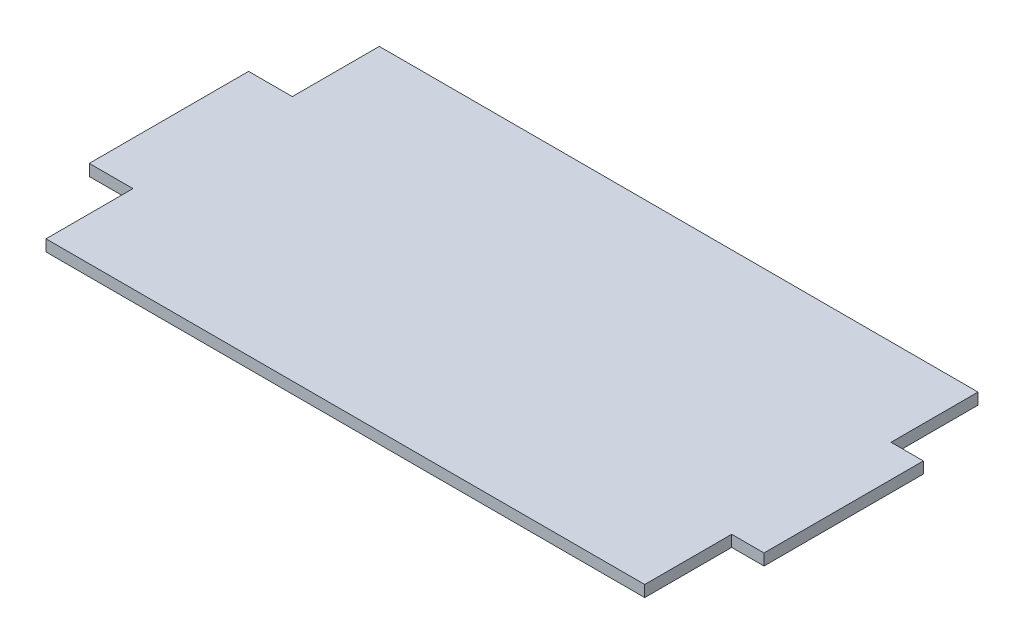
ISO-10303-21;
HEADER;
FILE_DESCRIPTION(('STEP AP214'),'2;1');
FILE_NAME('part.step','',(''),(''),'','','');
FILE_SCHEMA(('AUTOMOTIVE_DESIGN { 1 0 10303 214 1 1 1 1 }'));
ENDSEC;
DATA;
#1=APPLICATION_CONTEXT('core data for automotive mechanical design processes');
#2=APPLICATION_PROTOCOL_DEFINITION('international standard','automotive_design',2000,#1);
#3=PRODUCT_CONTEXT('',#1,'mechanical');
#4=PRODUCT('Part','Part','',(#3));
#5=PRODUCT_RELATED_PRODUCT_CATEGORY('part','',(#4));
#6=PRODUCT_DEFINITION_FORMATION('','',#4);
#7=PRODUCT_DEFINITION_CONTEXT('part definition',#1,'design');
#8=PRODUCT_DEFINITION('design','',#6,#7);
#9=PRODUCT_DEFINITION_SHAPE('','',#8);
#10=(LENGTH_UNIT() NAMED_UNIT(*) SI_UNIT(.MILLI.,.METRE.));
#11=(NAMED_UNIT(*) PLANE_ANGLE_UNIT() SI_UNIT($,.RADIAN.));
#12=(NAMED_UNIT(*) SI_UNIT($,.STERADIAN.) SOLID_ANGLE_UNIT());
#13=UNCERTAINTY_MEASURE_WITH_UNIT(LENGTH_MEASURE(1.E-05),#10,'distance_accuracy_value','');
#14=(GEOMETRIC_REPRESENTATION_CONTEXT(3) GLOBAL_UNCERTAINTY_ASSIGNED_CONTEXT((#13)) GLOBAL_UNIT_ASSIGNED_CONTEXT((#10,
#11,#12)) REPRESENTATION_CONTEXT('',''));
#15=CARTESIAN_POINT('',(0.,0.,0.));
#16=DIRECTION('',(0.,0.,1.));
#17=DIRECTION('',(1.,0.,0.));
#18=AXIS2_PLACEMENT_3D('',#15,#16,#17);
#19=CARTESIAN_POINT('',(0.,20.,35.));
#20=DIRECTION('',(0.,0.,1.));
#21=DIRECTION('',(1.,0.,0.));
#22=AXIS2_PLACEMENT_3D('',#19,#20,#21);
#23=PLANE('',#22);
#24=DIRECTION('',(-1.,0.,0.));
#25=VECTOR('',#24,1.);
#26=CARTESIAN_POINT('',(0.,15.,35.));
#27=LINE('',#26,#25);
#28=CARTESIAN_POINT('',(-129.,15.,35.0000000000001));
#29=VERTEX_POINT('',#28);
#30=CARTESIAN_POINT('',(-148.2,15.,35.0000000000001));
#31=VERTEX_POINT('',#30);
#32=EDGE_CURVE('E164',#29,#31,#27,.T.);
#33=ORIENTED_EDGE('',*,*,#32,.F.);
#34=DIRECTION('',(0.,-1.,0.));
#35=VECTOR('',#34,1.);
#36=CARTESIAN_POINT('',(-129.,20.,35.0000000000001));
#37=LINE('',#36,#35);
#38=CARTESIAN_POINT('',(-129.,20.,35.0000000000001));
#39=VERTEX_POINT('',#38);
#40=EDGE_CURVE('E11',#39,#29,#37,.T.);
#41=ORIENTED_EDGE('',*,*,#40,.F.);
#42=DIRECTION('',(-1.,0.,0.));
#43=VECTOR('',#42,1.);
#44=CARTESIAN_POINT('',(0.,20.,35.));
#45=LINE('',#44,#43);
#46=CARTESIAN_POINT('',(-148.2,20.,35.0000000000001));
#47=VERTEX_POINT('',#46);
#48=EDGE_CURVE('E190',#39,#47,#45,.T.);
#49=ORIENTED_EDGE('',*,*,#48,.T.);
#50=DIRECTION('',(0.,-1.,0.));
#51=VECTOR('',#50,1.);
#52=CARTESIAN_POINT('',(-148.2,20.,35.0000000000001));
#53=LINE('',#52,#51);
#54=EDGE_CURVE('E108',#47,#31,#53,.T.);
#55=ORIENTED_EDGE('',*,*,#54,.T.);
#56=EDGE_LOOP('',(#33,#41,#49,#55));
#57=FACE_BOUND('',#56,.T.);
#58=ADVANCED_FACE('F45',(#57),#23,.T.);
#59=CARTESIAN_POINT('',(-129.,20.,0.));
#60=DIRECTION('',(1.,0.,0.));
#61=DIRECTION('',(0.,0.,-1.));
#62=AXIS2_PLACEMENT_3D('',#59,#60,#61);
#63=PLANE('',#62);
#64=DIRECTION('',(0.,0.,1.));
#65=VECTOR('',#64,1.);
#66=CARTESIAN_POINT('',(-129.,15.,0.));
#67=LINE('',#66,#65);
#68=CARTESIAN_POINT('',(-129.,15.,73.2));
#69=VERTEX_POINT('',#68);
#70=EDGE_CURVE('E167',#29,#69,#67,.T.);
#71=ORIENTED_EDGE('',*,*,#70,.T.);
#72=DIRECTION('',(0.,-1.,0.));
#73=VECTOR('',#72,1.);
#74=CARTESIAN_POINT('',(-129.,20.,73.2));
#75=LINE('',#74,#73);
#76=CARTESIAN_POINT('',(-129.,20.,73.2));
#77=VERTEX_POINT('',#76);
#78=EDGE_CURVE('E53',#77,#69,#75,.T.);
#79=ORIENTED_EDGE('',*,*,#78,.F.);
#80=DIRECTION('',(0.,0.,1.));
#81=VECTOR('',#80,1.);
#82=CARTESIAN_POINT('',(-129.,20.,0.));
#83=LINE('',#82,#81);
#84=EDGE_CURVE('E150',#39,#77,#83,.T.);
#85=ORIENTED_EDGE('',*,*,#84,.F.);
#86=ORIENTED_EDGE('',*,*,#40,.T.);
#87=EDGE_LOOP('',(#71,#79,#85,#86));
#88=FACE_BOUND('',#87,.T.);
#89=ADVANCED_FACE('F257',(#88),#63,.F.);
#90=CARTESIAN_POINT('',(0.,20.,73.2));
#91=DIRECTION('',(0.,0.,-1.));
#92=DIRECTION('',(0.,1.,0.));
#93=AXIS2_PLACEMENT_3D('',#90,#91,#92);
#94=PLANE('',#93);
#95=DIRECTION('',(1.,0.,0.));
#96=VECTOR('',#95,1.);
#97=CARTESIAN_POINT('',(0.,15.,73.2));
#98=LINE('',#97,#96);
#99=CARTESIAN_POINT('',(134.,15.,73.2));
#100=VERTEX_POINT('',#99);
#101=EDGE_CURVE('E169',#69,#100,#98,.T.);
#102=ORIENTED_EDGE('',*,*,#101,.T.);
#103=DIRECTION('',(0.,-1.,0.));
#104=VECTOR('',#103,1.);
#105=CARTESIAN_POINT('',(134.,20.,73.2));
#106=LINE('',#105,#104);
#107=CARTESIAN_POINT('',(134.,20.,73.2));
#108=VERTEX_POINT('',#107);
#109=EDGE_CURVE('E205',#108,#100,#106,.T.);
#110=ORIENTED_EDGE('',*,*,#109,.F.);
#111=DIRECTION('',(1.,0.,0.));
#112=VECTOR('',#111,1.);
#113=CARTESIAN_POINT('',(0.,20.,73.2));
#114=LINE('',#113,#112);
#115=EDGE_CURVE('E213',#77,#108,#114,.T.);
#116=ORIENTED_EDGE('',*,*,#115,.F.);
#117=ORIENTED_EDGE('',*,*,#78,.T.);
#118=EDGE_LOOP('',(#102,#110,#116,#117));
#119=FACE_BOUND('',#118,.T.);
#120=ADVANCED_FACE('F211',(#119),#94,.F.);
#121=CARTESIAN_POINT('',(134.,20.,0.));
#122=DIRECTION('',(1.,0.,0.));
#123=DIRECTION('',(0.,0.,-1.));
#124=AXIS2_PLACEMENT_3D('',#121,#122,#123);
#125=PLANE('',#124);
#126=DIRECTION('',(0.,0.,1.));
#127=VECTOR('',#126,1.);
#128=CARTESIAN_POINT('',(134.,15.,0.));
#129=LINE('',#128,#127);
#130=CARTESIAN_POINT('',(134.,15.,35.));
#131=VERTEX_POINT('',#130);
#132=EDGE_CURVE('E172',#131,#100,#129,.T.);
#133=ORIENTED_EDGE('',*,*,#132,.F.);
#134=DIRECTION('',(0.,-1.,0.));
#135=VECTOR('',#134,1.);
#136=CARTESIAN_POINT('',(134.,20.,35.));
#137=LINE('',#136,#135);
#138=CARTESIAN_POINT('',(134.,20.,35.));
#139=VERTEX_POINT('',#138);
#140=EDGE_CURVE('E203',#139,#131,#137,.T.);
#141=ORIENTED_EDGE('',*,*,#140,.F.);
#142=DIRECTION('',(0.,0.,1.));
#143=VECTOR('',#142,1.);
#144=CARTESIAN_POINT('',(134.,20.,0.));
#145=LINE('',#144,#143);
#146=EDGE_CURVE('E226',#139,#108,#145,.T.);
#147=ORIENTED_EDGE('',*,*,#146,.T.);
#148=ORIENTED_EDGE('',*,*,#109,.T.);
#149=EDGE_LOOP('',(#133,#141,#147,#148));
#150=FACE_BOUND('',#149,.T.);
#151=ADVANCED_FACE('F222',(#150),#125,.T.);
#152=CARTESIAN_POINT('',(0.,20.,35.));
#153=DIRECTION('',(0.,0.,-1.));
#154=DIRECTION('',(0.,1.,0.));
#155=AXIS2_PLACEMENT_3D('',#152,#153,#154);
#156=PLANE('',#155);
#157=DIRECTION('',(1.,0.,0.));
#158=VECTOR('',#157,1.);
#159=CARTESIAN_POINT('',(0.,15.,35.));
#160=LINE('',#159,#158);
#161=CARTESIAN_POINT('',(148.2,15.,35.));
#162=VERTEX_POINT('',#161);
#163=EDGE_CURVE('E175',#131,#162,#160,.T.);
#164=ORIENTED_EDGE('',*,*,#163,.T.);
#165=DIRECTION('',(0.,-1.,0.));
#166=VECTOR('',#165,1.);
#167=CARTESIAN_POINT('',(148.2,20.,35.));
#168=LINE('',#167,#166);
#169=CARTESIAN_POINT('',(148.2,20.,35.));
#170=VERTEX_POINT('',#169);
#171=EDGE_CURVE('E200',#170,#162,#168,.T.);
#172=ORIENTED_EDGE('',*,*,#171,.F.);
#173=DIRECTION('',(1.,0.,0.));
#174=VECTOR('',#173,1.);
#175=CARTESIAN_POINT('',(0.,20.,35.));
#176=LINE('',#175,#174);
#177=EDGE_CURVE('E227',#139,#170,#176,.T.);
#178=ORIENTED_EDGE('',*,*,#177,.F.);
#179=ORIENTED_EDGE('',*,*,#140,.T.);
#180=EDGE_LOOP('',(#164,#172,#178,#179));
#181=FACE_BOUND('',#180,.T.);
#182=ADVANCED_FACE('F280',(#181),#156,.F.);
#183=CARTESIAN_POINT('',(148.2,20.,0.));
#184=DIRECTION('',(-1.,0.,0.));
#185=DIRECTION('',(0.,0.,1.));
#186=AXIS2_PLACEMENT_3D('',#183,#184,#185);
#187=PLANE('',#186);
#188=DIRECTION('',(0.,0.,-1.));
#189=VECTOR('',#188,1.);
#190=CARTESIAN_POINT('',(148.2,15.,0.));
#191=LINE('',#190,#189);
#192=CARTESIAN_POINT('',(148.2,15.,-35.0000000000001));
#193=VERTEX_POINT('',#192);
#194=EDGE_CURVE('E178',#162,#193,#191,.T.);
#195=ORIENTED_EDGE('',*,*,#194,.T.);
#196=DIRECTION('',(0.,-1.,0.));
#197=VECTOR('',#196,1.);
#198=CARTESIAN_POINT('',(148.2,20.,-35.0000000000001));
#199=LINE('',#198,#197);
#200=CARTESIAN_POINT('',(148.2,20.,-35.0000000000001));
#201=VERTEX_POINT('',#200);
#202=EDGE_CURVE('E198',#201,#193,#199,.T.);
#203=ORIENTED_EDGE('',*,*,#202,.F.);
#204=DIRECTION('',(0.,0.,-1.));
#205=VECTOR('',#204,1.);
#206=CARTESIAN_POINT('',(148.2,20.,0.));
#207=LINE('',#206,#205);
#208=EDGE_CURVE('E230',#170,#201,#207,.T.);
#209=ORIENTED_EDGE('',*,*,#208,.F.);
#210=ORIENTED_EDGE('',*,*,#171,.T.);
#211=EDGE_LOOP('',(#195,#203,#209,#210));
#212=FACE_BOUND('',#211,.T.);
#213=ADVANCED_FACE('F244',(#212),#187,.F.);
#214=CARTESIAN_POINT('',(0.,20.,-35.0000000000001));
#215=DIRECTION('',(0.,0.,-1.));
#216=DIRECTION('',(0.,1.,0.));
#217=AXIS2_PLACEMENT_3D('',#214,#215,#216);
#218=PLANE('',#217);
#219=DIRECTION('',(1.,0.,0.));
#220=VECTOR('',#219,1.);
#221=CARTESIAN_POINT('',(0.,15.,-35.0000000000001));
#222=LINE('',#221,#220);
#223=CARTESIAN_POINT('',(134.,15.,-35.0000000000001));
#224=VERTEX_POINT('',#223);
#225=EDGE_CURVE('E181',#224,#193,#222,.T.);
#226=ORIENTED_EDGE('',*,*,#225,.F.);
#227=DIRECTION('',(0.,-1.,0.));
#228=VECTOR('',#227,1.);
#229=CARTESIAN_POINT('',(134.,20.,-35.0000000000001));
#230=LINE('',#229,#228);
#231=CARTESIAN_POINT('',(134.,20.,-35.0000000000001));
#232=VERTEX_POINT('',#231);
#233=EDGE_CURVE('E196',#232,#224,#230,.T.);
#234=ORIENTED_EDGE('',*,*,#233,.F.);
#235=DIRECTION('',(1.,0.,0.));
#236=VECTOR('',#235,1.);
#237=CARTESIAN_POINT('',(0.,20.,-35.0000000000001));
#238=LINE('',#237,#236);
#239=EDGE_CURVE('E234',#232,#201,#238,.T.);
#240=ORIENTED_EDGE('',*,*,#239,.T.);
#241=ORIENTED_EDGE('',*,*,#202,.T.);
#242=EDGE_LOOP('',(#226,#234,#240,#241));
#243=FACE_BOUND('',#242,.T.);
#244=ADVANCED_FACE('F246',(#243),#218,.T.);
#245=CARTESIAN_POINT('',(134.,15.,-73.2000000000002));
#246=VERTEX_POINT('',#245);
#247=EDGE_CURVE('E176',#246,#224,#129,.T.);
#248=ORIENTED_EDGE('',*,*,#247,.F.);
#249=DIRECTION('',(0.,-1.,0.));
#250=VECTOR('',#249,1.);
#251=CARTESIAN_POINT('',(134.,20.,-73.2000000000002));
#252=LINE('',#251,#250);
#253=CARTESIAN_POINT('',(134.,20.,-73.2000000000002));
#254=VERTEX_POINT('',#253);
#255=EDGE_CURVE('E194',#254,#246,#252,.T.);
#256=ORIENTED_EDGE('',*,*,#255,.F.);
#257=EDGE_CURVE('E229',#254,#232,#145,.T.);
#258=ORIENTED_EDGE('',*,*,#257,.T.);
#259=ORIENTED_EDGE('',*,*,#233,.T.);
#260=EDGE_LOOP('',(#248,#256,#258,#259));
#261=FACE_BOUND('',#260,.T.);
#262=ADVANCED_FACE('F250',(#261),#125,.T.);
#263=CARTESIAN_POINT('',(0.,20.,-73.2000000000001));
#264=DIRECTION('',(0.,0.,-1.));
#265=DIRECTION('',(-1.,0.,0.));
#266=AXIS2_PLACEMENT_3D('',#263,#264,#265);
#267=PLANE('',#266);
#268=DIRECTION('',(1.,0.,0.));
#269=VECTOR('',#268,1.);
#270=CARTESIAN_POINT('',(0.,15.,-73.2000000000001));
#271=LINE('',#270,#269);
#272=CARTESIAN_POINT('',(-129.,15.,-73.2000000000001));
#273=VERTEX_POINT('',#272);
#274=EDGE_CURVE('E184',#273,#246,#271,.T.);
#275=ORIENTED_EDGE('',*,*,#274,.F.);
#276=DIRECTION('',(0.,-1.,0.));
#277=VECTOR('',#276,1.);
#278=CARTESIAN_POINT('',(-129.,20.,-73.2000000000001));
#279=LINE('',#278,#277);
#280=CARTESIAN_POINT('',(-129.,20.,-73.2000000000001));
#281=VERTEX_POINT('',#280);
#282=EDGE_CURVE('E155',#281,#273,#279,.T.);
#283=ORIENTED_EDGE('',*,*,#282,.F.);
#284=DIRECTION('',(1.,0.,0.));
#285=VECTOR('',#284,1.);
#286=CARTESIAN_POINT('',(0.,20.,-73.2000000000001));
#287=LINE('',#286,#285);
#288=EDGE_CURVE('E147',#281,#254,#287,.T.);
#289=ORIENTED_EDGE('',*,*,#288,.T.);
#290=ORIENTED_EDGE('',*,*,#255,.T.);
#291=EDGE_LOOP('',(#275,#283,#289,#290));
#292=FACE_BOUND('',#291,.T.);
#293=ADVANCED_FACE('F252',(#292),#267,.T.);
#294=CARTESIAN_POINT('',(-129.,15.,-35.));
#295=VERTEX_POINT('',#294);
#296=EDGE_CURVE('E154',#273,#295,#67,.T.);
#297=ORIENTED_EDGE('',*,*,#296,.T.);
#298=DIRECTION('',(0.,-1.,0.));
#299=VECTOR('',#298,1.);
#300=CARTESIAN_POINT('',(-129.,20.,-35.));
#301=LINE('',#300,#299);
#302=CARTESIAN_POINT('',(-129.,20.,-35.));
#303=VERTEX_POINT('',#302);
#304=EDGE_CURVE('E151',#303,#295,#301,.T.);
#305=ORIENTED_EDGE('',*,*,#304,.F.);
#306=EDGE_CURVE('E140',#281,#303,#83,.T.);
#307=ORIENTED_EDGE('',*,*,#306,.F.);
#308=ORIENTED_EDGE('',*,*,#282,.T.);
#309=EDGE_LOOP('',(#297,#305,#307,#308));
#310=FACE_BOUND('',#309,.T.);
#311=ADVANCED_FACE('F152',(#310),#63,.F.);
#312=CARTESIAN_POINT('',(0.,20.,-35.));
#313=DIRECTION('',(0.,0.,1.));
#314=DIRECTION('',(0.,-1.,0.));
#315=AXIS2_PLACEMENT_3D('',#312,#313,#314);
#316=PLANE('',#315);
#317=DIRECTION('',(-1.,0.,0.));
#318=VECTOR('',#317,1.);
#319=CARTESIAN_POINT('',(0.,15.,-35.));
#320=LINE('',#319,#318);
#321=CARTESIAN_POINT('',(-148.2,15.,-35.));
#322=VERTEX_POINT('',#321);
#323=EDGE_CURVE('E101',#295,#322,#320,.T.);
#324=ORIENTED_EDGE('',*,*,#323,.T.);
#325=DIRECTION('',(0.,-1.,0.));
#326=VECTOR('',#325,1.);
#327=CARTESIAN_POINT('',(-148.2,20.,-35.));
#328=LINE('',#327,#326);
#329=CARTESIAN_POINT('',(-148.2,20.,-35.));
#330=VERTEX_POINT('',#329);
#331=EDGE_CURVE('E156',#330,#322,#328,.T.);
#332=ORIENTED_EDGE('',*,*,#331,.F.);
#333=DIRECTION('',(-1.,0.,0.));
#334=VECTOR('',#333,1.);
#335=CARTESIAN_POINT('',(0.,20.,-35.));
#336=LINE('',#335,#334);
#337=EDGE_CURVE('E144',#303,#330,#336,.T.);
#338=ORIENTED_EDGE('',*,*,#337,.F.);
#339=ORIENTED_EDGE('',*,*,#304,.T.);
#340=EDGE_LOOP('',(#324,#332,#338,#339));
#341=FACE_BOUND('',#340,.T.);
#342=ADVANCED_FACE('F158',(#341),#316,.F.);
#343=CARTESIAN_POINT('',(-148.2,20.,0.));
#344=DIRECTION('',(1.,0.,0.));
#345=DIRECTION('',(0.,0.,-1.));
#346=AXIS2_PLACEMENT_3D('',#343,#344,#345);
#347=PLANE('',#346);
#348=DIRECTION('',(0.,0.,1.));
#349=VECTOR('',#348,1.);
#350=CARTESIAN_POINT('',(-148.2,15.,0.));
#351=LINE('',#350,#349);
#352=EDGE_CURVE('E188',#322,#31,#351,.T.);
#353=ORIENTED_EDGE('',*,*,#352,.T.);
#354=ORIENTED_EDGE('',*,*,#54,.F.);
#355=DIRECTION('',(0.,0.,1.));
#356=VECTOR('',#355,1.);
#357=CARTESIAN_POINT('',(-148.2,20.,0.));
#358=LINE('',#357,#356);
#359=EDGE_CURVE('E61',#330,#47,#358,.T.);
#360=ORIENTED_EDGE('',*,*,#359,.F.);
#361=ORIENTED_EDGE('',*,*,#331,.T.);
#362=EDGE_LOOP('',(#353,#354,#360,#361));
#363=FACE_BOUND('',#362,.T.);
#364=ADVANCED_FACE('F255',(#363),#347,.F.);
#365=CARTESIAN_POINT('',(0.,20.,0.));
#366=DIRECTION('',(0.,1.,0.));
#367=DIRECTION('',(0.,0.,1.));
#368=AXIS2_PLACEMENT_3D('',#365,#366,#367);
#369=PLANE('',#368);
#370=ORIENTED_EDGE('',*,*,#48,.F.);
#371=ORIENTED_EDGE('',*,*,#84,.T.);
#372=ORIENTED_EDGE('',*,*,#115,.T.);
#373=ORIENTED_EDGE('',*,*,#146,.F.);
#374=ORIENTED_EDGE('',*,*,#177,.T.);
#375=ORIENTED_EDGE('',*,*,#208,.T.);
#376=ORIENTED_EDGE('',*,*,#239,.F.);
#377=ORIENTED_EDGE('',*,*,#257,.F.);
#378=ORIENTED_EDGE('',*,*,#288,.F.);
#379=ORIENTED_EDGE('',*,*,#306,.T.);
#380=ORIENTED_EDGE('',*,*,#337,.T.);
#381=ORIENTED_EDGE('',*,*,#359,.T.);
#382=EDGE_LOOP('',(#370,#371,#372,#373,#374,#375,#376,#377,#378,#379,#380,#381));
#383=FACE_BOUND('',#382,.T.);
#384=ADVANCED_FACE('F142',(#383),#369,.T.);
#385=CARTESIAN_POINT('',(0.,15.,0.));
#386=DIRECTION('',(0.,1.,0.));
#387=DIRECTION('',(0.,0.,1.));
#388=AXIS2_PLACEMENT_3D('',#385,#386,#387);
#389=PLANE('',#388);
#390=ORIENTED_EDGE('',*,*,#32,.T.);
#391=ORIENTED_EDGE('',*,*,#352,.F.);
#392=ORIENTED_EDGE('',*,*,#323,.F.);
#393=ORIENTED_EDGE('',*,*,#296,.F.);
#394=ORIENTED_EDGE('',*,*,#274,.T.);
#395=ORIENTED_EDGE('',*,*,#247,.T.);
#396=ORIENTED_EDGE('',*,*,#225,.T.);
#397=ORIENTED_EDGE('',*,*,#194,.F.);
#398=ORIENTED_EDGE('',*,*,#163,.F.);
#399=ORIENTED_EDGE('',*,*,#132,.T.);
#400=ORIENTED_EDGE('',*,*,#101,.F.);
#401=ORIENTED_EDGE('',*,*,#70,.F.);
#402=EDGE_LOOP('',(#390,#391,#392,#393,#394,#395,#396,#397,#398,#399,#400,#401));
#403=FACE_BOUND('',#402,.T.);
#404=ADVANCED_FACE('F217',(#403),#389,.F.);
#405=CLOSED_SHELL('',(#58,#89,#120,#151,#182,#213,#244,#262,#293,#311,#342,#364,#384,#404));
#406=MANIFOLD_SOLID_BREP('B2',#405);
#407=ADVANCED_BREP_SHAPE_REPRESENTATION('',(#18,#406),#14);
#408=SHAPE_DEFINITION_REPRESENTATION(#9,#407);
ENDSEC;
END-ISO-10303-21;
